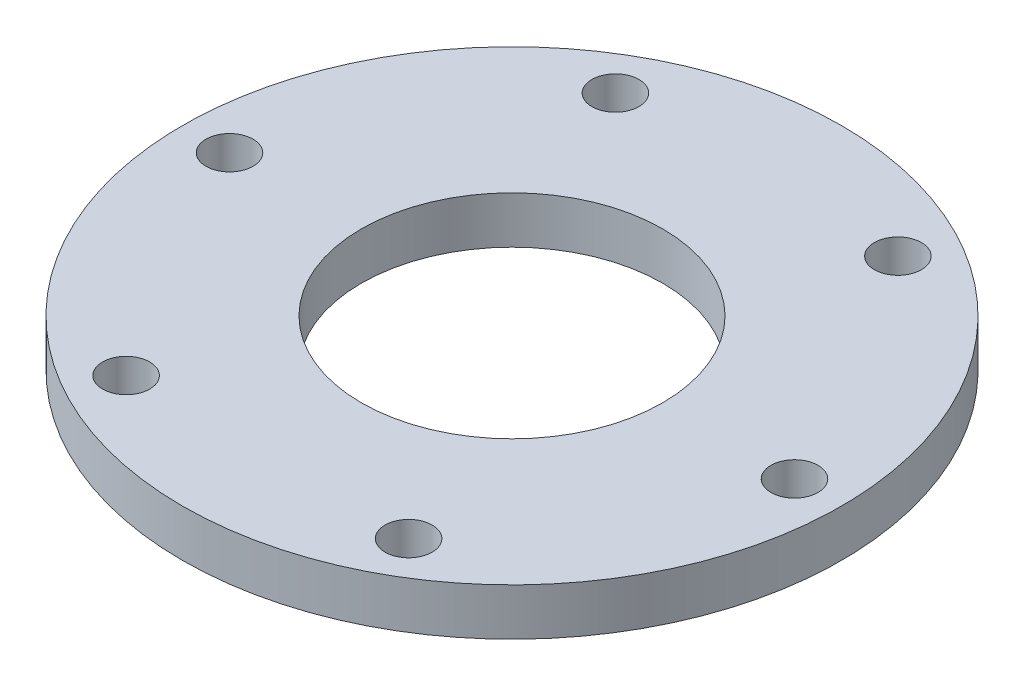
ISO-10303-21;
HEADER;
FILE_DESCRIPTION(('STEP AP214'),'2;1');
FILE_NAME('part.step','',(''),(''),'','','');
FILE_SCHEMA(('AUTOMOTIVE_DESIGN { 1 0 10303 214 1 1 1 1 }'));
ENDSEC;
DATA;
#1=APPLICATION_CONTEXT('core data for automotive mechanical design processes');
#2=APPLICATION_PROTOCOL_DEFINITION('international standard','automotive_design',2000,#1);
#3=PRODUCT_CONTEXT('',#1,'mechanical');
#4=PRODUCT('Part','Part','',(#3));
#5=PRODUCT_RELATED_PRODUCT_CATEGORY('part','',(#4));
#6=PRODUCT_DEFINITION_FORMATION('','',#4);
#7=PRODUCT_DEFINITION_CONTEXT('part definition',#1,'design');
#8=PRODUCT_DEFINITION('design','',#6,#7);
#9=PRODUCT_DEFINITION_SHAPE('','',#8);
#10=(LENGTH_UNIT() NAMED_UNIT(*) SI_UNIT(.MILLI.,.METRE.));
#11=(NAMED_UNIT(*) PLANE_ANGLE_UNIT() SI_UNIT($,.RADIAN.));
#12=(NAMED_UNIT(*) SI_UNIT($,.STERADIAN.) SOLID_ANGLE_UNIT());
#13=UNCERTAINTY_MEASURE_WITH_UNIT(LENGTH_MEASURE(1.E-05),#10,'distance_accuracy_value','');
#14=(GEOMETRIC_REPRESENTATION_CONTEXT(3) GLOBAL_UNCERTAINTY_ASSIGNED_CONTEXT((#13)) GLOBAL_UNIT_ASSIGNED_CONTEXT((#10,
#11,#12)) REPRESENTATION_CONTEXT('',''));
#15=CARTESIAN_POINT('',(0.,0.,0.));
#16=DIRECTION('',(0.,0.,1.));
#17=DIRECTION('',(1.,0.,0.));
#18=AXIS2_PLACEMENT_3D('',#15,#16,#17);
#19=CARTESIAN_POINT('',(0.,6.35,0.));
#20=DIRECTION('',(0.,1.,0.));
#21=DIRECTION('',(0.,0.,1.));
#22=AXIS2_PLACEMENT_3D('',#19,#20,#21);
#23=PLANE('',#22);
#24=CARTESIAN_POINT('',(-19.05,6.35,-32.9955678841871));
#25=DIRECTION('',(0.,1.,0.));
#26=DIRECTION('',(0.,0.,1.));
#27=AXIS2_PLACEMENT_3D('',#24,#25,#26);
#28=CIRCLE('',#27,3.175);
#29=CARTESIAN_POINT('',(-19.05,6.35,-29.8205678841871));
#30=VERTEX_POINT('',#29);
#31=EDGE_CURVE('E94',#30,#30,#28,.T.);
#32=ORIENTED_EDGE('',*,*,#31,.F.);
#33=EDGE_LOOP('',(#32));
#34=FACE_BOUND('',#33,.T.);
#35=CARTESIAN_POINT('',(-19.05,6.35,32.9955678841871));
#36=DIRECTION('',(0.,1.,0.));
#37=DIRECTION('',(0.,0.,1.));
#38=AXIS2_PLACEMENT_3D('',#35,#36,#37);
#39=CIRCLE('',#38,3.175);
#40=CARTESIAN_POINT('',(-19.05,6.35,36.1705678841871));
#41=VERTEX_POINT('',#40);
#42=EDGE_CURVE('E78',#41,#41,#39,.T.);
#43=ORIENTED_EDGE('',*,*,#42,.F.);
#44=EDGE_LOOP('',(#43));
#45=FACE_BOUND('',#44,.T.);
#46=CARTESIAN_POINT('',(38.1,6.35,0.));
#47=DIRECTION('',(0.,1.,0.));
#48=DIRECTION('',(0.,0.,1.));
#49=AXIS2_PLACEMENT_3D('',#46,#47,#48);
#50=CIRCLE('',#49,3.175);
#51=CARTESIAN_POINT('',(38.1,6.35,3.175));
#52=VERTEX_POINT('',#51);
#53=EDGE_CURVE('E62',#52,#52,#50,.T.);
#54=ORIENTED_EDGE('',*,*,#53,.F.);
#55=EDGE_LOOP('',(#54));
#56=FACE_BOUND('',#55,.T.);
#57=CARTESIAN_POINT('',(0.,6.35,0.));
#58=DIRECTION('',(0.,1.,0.));
#59=DIRECTION('',(0.,0.,1.));
#60=AXIS2_PLACEMENT_3D('',#57,#58,#59);
#61=CIRCLE('',#60,44.45);
#62=CARTESIAN_POINT('',(0.,6.35,44.45));
#63=VERTEX_POINT('',#62);
#64=EDGE_CURVE('E10',#63,#63,#61,.T.);
#65=ORIENTED_EDGE('',*,*,#64,.T.);
#66=EDGE_LOOP('',(#65));
#67=FACE_BOUND('',#66,.T.);
#68=CARTESIAN_POINT('',(0.,6.35,0.));
#69=DIRECTION('',(0.,1.,0.));
#70=DIRECTION('',(0.,0.,1.));
#71=AXIS2_PLACEMENT_3D('',#68,#69,#70);
#72=CIRCLE('',#71,20.32);
#73=CARTESIAN_POINT('',(0.,6.35,20.32));
#74=VERTEX_POINT('',#73);
#75=EDGE_CURVE('E56',#74,#74,#72,.T.);
#76=ORIENTED_EDGE('',*,*,#75,.F.);
#77=EDGE_LOOP('',(#76));
#78=FACE_BOUND('',#77,.T.);
#79=CARTESIAN_POINT('',(19.05,6.35,32.9955678841871));
#80=DIRECTION('',(0.,1.,0.));
#81=DIRECTION('',(0.,0.,1.));
#82=AXIS2_PLACEMENT_3D('',#79,#80,#81);
#83=CIRCLE('',#82,3.175);
#84=CARTESIAN_POINT('',(19.05,6.35,36.1705678841871));
#85=VERTEX_POINT('',#84);
#86=EDGE_CURVE('E70',#85,#85,#83,.T.);
#87=ORIENTED_EDGE('',*,*,#86,.F.);
#88=EDGE_LOOP('',(#87));
#89=FACE_BOUND('',#88,.T.);
#90=CARTESIAN_POINT('',(-38.1,6.35,0.));
#91=DIRECTION('',(0.,1.,0.));
#92=DIRECTION('',(0.,0.,1.));
#93=AXIS2_PLACEMENT_3D('',#90,#91,#92);
#94=CIRCLE('',#93,3.175);
#95=CARTESIAN_POINT('',(-38.1,6.35,3.175));
#96=VERTEX_POINT('',#95);
#97=EDGE_CURVE('E86',#96,#96,#94,.T.);
#98=ORIENTED_EDGE('',*,*,#97,.F.);
#99=EDGE_LOOP('',(#98));
#100=FACE_BOUND('',#99,.T.);
#101=CARTESIAN_POINT('',(19.05,6.35,-32.9955678841871));
#102=DIRECTION('',(0.,1.,0.));
#103=DIRECTION('',(0.,0.,1.));
#104=AXIS2_PLACEMENT_3D('',#101,#102,#103);
#105=CIRCLE('',#104,3.175);
#106=CARTESIAN_POINT('',(19.05,6.35,-29.8205678841871));
#107=VERTEX_POINT('',#106);
#108=EDGE_CURVE('E102',#107,#107,#105,.T.);
#109=ORIENTED_EDGE('',*,*,#108,.F.);
#110=EDGE_LOOP('',(#109));
#111=FACE_BOUND('',#110,.T.);
#112=ADVANCED_FACE('F43',(#34,#45,#56,#67,#78,#89,#100,#111),#23,.T.);
#113=CARTESIAN_POINT('',(0.,0.,0.));
#114=DIRECTION('',(0.,1.,0.));
#115=DIRECTION('',(0.,0.,1.));
#116=AXIS2_PLACEMENT_3D('',#113,#114,#115);
#117=PLANE('',#116);
#118=CARTESIAN_POINT('',(0.,0.,0.));
#119=DIRECTION('',(0.,1.,0.));
#120=DIRECTION('',(0.,0.,1.));
#121=AXIS2_PLACEMENT_3D('',#118,#119,#120);
#122=CIRCLE('',#121,44.45);
#123=CARTESIAN_POINT('',(0.,0.,44.45));
#124=VERTEX_POINT('',#123);
#125=EDGE_CURVE('E47',#124,#124,#122,.T.);
#126=ORIENTED_EDGE('',*,*,#125,.F.);
#127=EDGE_LOOP('',(#126));
#128=FACE_BOUND('',#127,.T.);
#129=CARTESIAN_POINT('',(0.,0.,0.));
#130=DIRECTION('',(0.,1.,0.));
#131=DIRECTION('',(0.,0.,1.));
#132=AXIS2_PLACEMENT_3D('',#129,#130,#131);
#133=CIRCLE('',#132,20.32);
#134=CARTESIAN_POINT('',(0.,0.,20.32));
#135=VERTEX_POINT('',#134);
#136=EDGE_CURVE('E58',#135,#135,#133,.T.);
#137=ORIENTED_EDGE('',*,*,#136,.T.);
#138=EDGE_LOOP('',(#137));
#139=FACE_BOUND('',#138,.T.);
#140=CARTESIAN_POINT('',(38.1,0.,0.));
#141=DIRECTION('',(0.,1.,0.));
#142=DIRECTION('',(0.,0.,1.));
#143=AXIS2_PLACEMENT_3D('',#140,#141,#142);
#144=CIRCLE('',#143,3.175);
#145=CARTESIAN_POINT('',(38.1,0.,3.175));
#146=VERTEX_POINT('',#145);
#147=EDGE_CURVE('E66',#146,#146,#144,.T.);
#148=ORIENTED_EDGE('',*,*,#147,.T.);
#149=EDGE_LOOP('',(#148));
#150=FACE_BOUND('',#149,.T.);
#151=CARTESIAN_POINT('',(19.05,0.,32.9955678841871));
#152=DIRECTION('',(0.,1.,0.));
#153=DIRECTION('',(0.,0.,1.));
#154=AXIS2_PLACEMENT_3D('',#151,#152,#153);
#155=CIRCLE('',#154,3.175);
#156=CARTESIAN_POINT('',(19.05,0.,36.1705678841871));
#157=VERTEX_POINT('',#156);
#158=EDGE_CURVE('E74',#157,#157,#155,.T.);
#159=ORIENTED_EDGE('',*,*,#158,.T.);
#160=EDGE_LOOP('',(#159));
#161=FACE_BOUND('',#160,.T.);
#162=CARTESIAN_POINT('',(-19.05,0.,32.9955678841871));
#163=DIRECTION('',(0.,1.,0.));
#164=DIRECTION('',(0.,0.,1.));
#165=AXIS2_PLACEMENT_3D('',#162,#163,#164);
#166=CIRCLE('',#165,3.175);
#167=CARTESIAN_POINT('',(-19.05,0.,36.1705678841871));
#168=VERTEX_POINT('',#167);
#169=EDGE_CURVE('E82',#168,#168,#166,.T.);
#170=ORIENTED_EDGE('',*,*,#169,.T.);
#171=EDGE_LOOP('',(#170));
#172=FACE_BOUND('',#171,.T.);
#173=CARTESIAN_POINT('',(-38.1,0.,0.));
#174=DIRECTION('',(0.,1.,0.));
#175=DIRECTION('',(0.,0.,1.));
#176=AXIS2_PLACEMENT_3D('',#173,#174,#175);
#177=CIRCLE('',#176,3.175);
#178=CARTESIAN_POINT('',(-38.1,0.,3.175));
#179=VERTEX_POINT('',#178);
#180=EDGE_CURVE('E90',#179,#179,#177,.T.);
#181=ORIENTED_EDGE('',*,*,#180,.T.);
#182=EDGE_LOOP('',(#181));
#183=FACE_BOUND('',#182,.T.);
#184=CARTESIAN_POINT('',(-19.05,0.,-32.9955678841871));
#185=DIRECTION('',(0.,1.,0.));
#186=DIRECTION('',(0.,0.,1.));
#187=AXIS2_PLACEMENT_3D('',#184,#185,#186);
#188=CIRCLE('',#187,3.175);
#189=CARTESIAN_POINT('',(-19.05,0.,-29.8205678841871));
#190=VERTEX_POINT('',#189);
#191=EDGE_CURVE('E98',#190,#190,#188,.T.);
#192=ORIENTED_EDGE('',*,*,#191,.T.);
#193=EDGE_LOOP('',(#192));
#194=FACE_BOUND('',#193,.T.);
#195=CARTESIAN_POINT('',(19.05,0.,-32.9955678841871));
#196=DIRECTION('',(0.,1.,0.));
#197=DIRECTION('',(0.,0.,1.));
#198=AXIS2_PLACEMENT_3D('',#195,#196,#197);
#199=CIRCLE('',#198,3.175);
#200=CARTESIAN_POINT('',(19.05,0.,-29.8205678841871));
#201=VERTEX_POINT('',#200);
#202=EDGE_CURVE('E106',#201,#201,#199,.T.);
#203=ORIENTED_EDGE('',*,*,#202,.T.);
#204=EDGE_LOOP('',(#203));
#205=FACE_BOUND('',#204,.T.);
#206=ADVANCED_FACE('F118',(#128,#139,#150,#161,#172,#183,#194,#205),#117,.F.);
#207=CARTESIAN_POINT('',(0.,6.35,0.));
#208=DIRECTION('',(0.,-1.,0.));
#209=DIRECTION('',(0.,0.,-1.));
#210=AXIS2_PLACEMENT_3D('',#207,#208,#209);
#211=CYLINDRICAL_SURFACE('',#210,44.45);
#212=ORIENTED_EDGE('',*,*,#64,.F.);
#213=EDGE_LOOP('',(#212));
#214=FACE_BOUND('',#213,.T.);
#215=ORIENTED_EDGE('',*,*,#125,.T.);
#216=EDGE_LOOP('',(#215));
#217=FACE_BOUND('',#216,.T.);
#218=ADVANCED_FACE('F45',(#214,#217),#211,.T.);
#219=CARTESIAN_POINT('',(0.,6.35,0.));
#220=DIRECTION('',(0.,-1.,0.));
#221=DIRECTION('',(0.,0.,-1.));
#222=AXIS2_PLACEMENT_3D('',#219,#220,#221);
#223=CYLINDRICAL_SURFACE('',#222,20.32);
#224=ORIENTED_EDGE('',*,*,#75,.T.);
#225=EDGE_LOOP('',(#224));
#226=FACE_BOUND('',#225,.T.);
#227=ORIENTED_EDGE('',*,*,#136,.F.);
#228=EDGE_LOOP('',(#227));
#229=FACE_BOUND('',#228,.T.);
#230=ADVANCED_FACE('F128',(#226,#229),#223,.F.);
#231=CARTESIAN_POINT('',(38.1,6.35,0.));
#232=DIRECTION('',(0.,-1.,0.));
#233=DIRECTION('',(0.,0.,-1.));
#234=AXIS2_PLACEMENT_3D('',#231,#232,#233);
#235=CYLINDRICAL_SURFACE('',#234,3.175);
#236=ORIENTED_EDGE('',*,*,#53,.T.);
#237=EDGE_LOOP('',(#236));
#238=FACE_BOUND('',#237,.T.);
#239=ORIENTED_EDGE('',*,*,#147,.F.);
#240=EDGE_LOOP('',(#239));
#241=FACE_BOUND('',#240,.T.);
#242=ADVANCED_FACE('F131',(#238,#241),#235,.F.);
#243=CARTESIAN_POINT('',(19.05,6.35,32.9955678841871));
#244=DIRECTION('',(0.,-1.,0.));
#245=DIRECTION('',(0.,0.,-1.));
#246=AXIS2_PLACEMENT_3D('',#243,#244,#245);
#247=CYLINDRICAL_SURFACE('',#246,3.175);
#248=ORIENTED_EDGE('',*,*,#86,.T.);
#249=EDGE_LOOP('',(#248));
#250=FACE_BOUND('',#249,.T.);
#251=ORIENTED_EDGE('',*,*,#158,.F.);
#252=EDGE_LOOP('',(#251));
#253=FACE_BOUND('',#252,.T.);
#254=ADVANCED_FACE('F135',(#250,#253),#247,.F.);
#255=CARTESIAN_POINT('',(-19.05,6.35,32.9955678841871));
#256=DIRECTION('',(0.,-1.,0.));
#257=DIRECTION('',(0.,0.,-1.));
#258=AXIS2_PLACEMENT_3D('',#255,#256,#257);
#259=CYLINDRICAL_SURFACE('',#258,3.175);
#260=ORIENTED_EDGE('',*,*,#42,.T.);
#261=EDGE_LOOP('',(#260));
#262=FACE_BOUND('',#261,.T.);
#263=ORIENTED_EDGE('',*,*,#169,.F.);
#264=EDGE_LOOP('',(#263));
#265=FACE_BOUND('',#264,.T.);
#266=ADVANCED_FACE('F139',(#262,#265),#259,.F.);
#267=CARTESIAN_POINT('',(-38.1,6.35,0.));
#268=DIRECTION('',(0.,-1.,0.));
#269=DIRECTION('',(0.,0.,-1.));
#270=AXIS2_PLACEMENT_3D('',#267,#268,#269);
#271=CYLINDRICAL_SURFACE('',#270,3.175);
#272=ORIENTED_EDGE('',*,*,#97,.T.);
#273=EDGE_LOOP('',(#272));
#274=FACE_BOUND('',#273,.T.);
#275=ORIENTED_EDGE('',*,*,#180,.F.);
#276=EDGE_LOOP('',(#275));
#277=FACE_BOUND('',#276,.T.);
#278=ADVANCED_FACE('F143',(#274,#277),#271,.F.);
#279=CARTESIAN_POINT('',(-19.05,6.35,-32.9955678841871));
#280=DIRECTION('',(0.,-1.,0.));
#281=DIRECTION('',(0.,0.,-1.));
#282=AXIS2_PLACEMENT_3D('',#279,#280,#281);
#283=CYLINDRICAL_SURFACE('',#282,3.175);
#284=ORIENTED_EDGE('',*,*,#31,.T.);
#285=EDGE_LOOP('',(#284));
#286=FACE_BOUND('',#285,.T.);
#287=ORIENTED_EDGE('',*,*,#191,.F.);
#288=EDGE_LOOP('',(#287));
#289=FACE_BOUND('',#288,.T.);
#290=ADVANCED_FACE('F147',(#286,#289),#283,.F.);
#291=CARTESIAN_POINT('',(19.05,6.35,-32.9955678841871));
#292=DIRECTION('',(0.,-1.,0.));
#293=DIRECTION('',(0.,0.,-1.));
#294=AXIS2_PLACEMENT_3D('',#291,#292,#293);
#295=CYLINDRICAL_SURFACE('',#294,3.175);
#296=ORIENTED_EDGE('',*,*,#108,.T.);
#297=EDGE_LOOP('',(#296));
#298=FACE_BOUND('',#297,.T.);
#299=ORIENTED_EDGE('',*,*,#202,.F.);
#300=EDGE_LOOP('',(#299));
#301=FACE_BOUND('',#300,.T.);
#302=ADVANCED_FACE('F114',(#298,#301),#295,.F.);
#303=CLOSED_SHELL('',(#112,#206,#218,#230,#242,#254,#266,#278,#290,#302));
#304=MANIFOLD_SOLID_BREP('B2',#303);
#305=ADVANCED_BREP_SHAPE_REPRESENTATION('',(#18,#304),#14);
#306=SHAPE_DEFINITION_REPRESENTATION(#9,#305);
ENDSEC;
END-ISO-10303-21;
